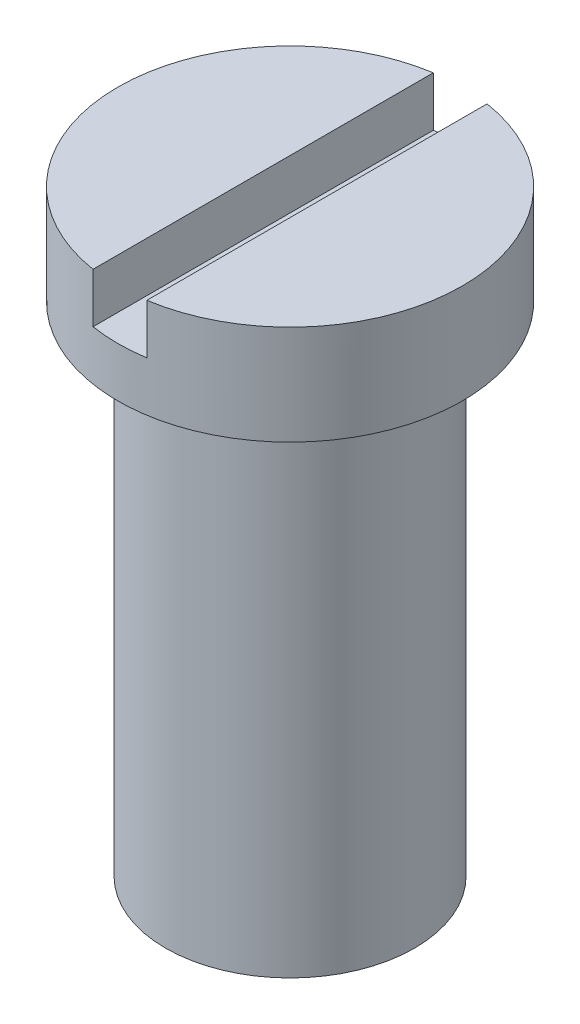
ISO-10303-21;
HEADER;
FILE_DESCRIPTION(('STEP AP214'),'2;1');
FILE_NAME('part.step','',(''),(''),'','','');
FILE_SCHEMA(('AUTOMOTIVE_DESIGN { 1 0 10303 214 1 1 1 1 }'));
ENDSEC;
DATA;
#1=APPLICATION_CONTEXT('core data for automotive mechanical design processes');
#2=APPLICATION_PROTOCOL_DEFINITION('international standard','automotive_design',2000,#1);
#3=PRODUCT_CONTEXT('',#1,'mechanical');
#4=PRODUCT('Part','Part','',(#3));
#5=PRODUCT_RELATED_PRODUCT_CATEGORY('part','',(#4));
#6=PRODUCT_DEFINITION_FORMATION('','',#4);
#7=PRODUCT_DEFINITION_CONTEXT('part definition',#1,'design');
#8=PRODUCT_DEFINITION('design','',#6,#7);
#9=PRODUCT_DEFINITION_SHAPE('','',#8);
#10=(LENGTH_UNIT() NAMED_UNIT(*) SI_UNIT(.MILLI.,.METRE.));
#11=(NAMED_UNIT(*) PLANE_ANGLE_UNIT() SI_UNIT($,.RADIAN.));
#12=(NAMED_UNIT(*) SI_UNIT($,.STERADIAN.) SOLID_ANGLE_UNIT());
#13=UNCERTAINTY_MEASURE_WITH_UNIT(LENGTH_MEASURE(1.E-05),#10,'distance_accuracy_value','');
#14=(GEOMETRIC_REPRESENTATION_CONTEXT(3) GLOBAL_UNCERTAINTY_ASSIGNED_CONTEXT((#13)) GLOBAL_UNIT_ASSIGNED_CONTEXT((#10,
#11,#12)) REPRESENTATION_CONTEXT('',''));
#15=CARTESIAN_POINT('',(0.,0.,0.));
#16=DIRECTION('',(0.,0.,1.));
#17=DIRECTION('',(1.,0.,0.));
#18=AXIS2_PLACEMENT_3D('',#15,#16,#17);
#19=CARTESIAN_POINT('',(0.,12.,0.));
#20=DIRECTION('',(0.,1.,0.));
#21=DIRECTION('',(0.,0.,1.));
#22=AXIS2_PLACEMENT_3D('',#19,#20,#21);
#23=PLANE('',#22);
#24=CARTESIAN_POINT('',(0.,12.,0.));
#25=DIRECTION('',(0.,-1.,0.));
#26=DIRECTION('',(0.,0.,-1.));
#27=AXIS2_PLACEMENT_3D('',#24,#25,#26);
#28=CIRCLE('',#27,3.46);
#29=CARTESIAN_POINT('',(-0.54,12.,3.41760149812701));
#30=VERTEX_POINT('',#29);
#31=CARTESIAN_POINT('',(-0.54,12.,-3.41760149812701));
#32=VERTEX_POINT('',#31);
#33=EDGE_CURVE('E39',#30,#32,#28,.T.);
#34=ORIENTED_EDGE('',*,*,#33,.F.);
#35=DIRECTION('',(0.,0.,-1.));
#36=VECTOR('',#35,1.);
#37=CARTESIAN_POINT('',(-0.54,12.,3.461));
#38=LINE('',#37,#36);
#39=EDGE_CURVE('E81',#30,#32,#38,.T.);
#40=ORIENTED_EDGE('',*,*,#39,.T.);
#41=EDGE_LOOP('',(#34,#40));
#42=FACE_BOUND('',#41,.T.);
#43=ADVANCED_FACE('F32',(#42),#23,.T.);
#44=CARTESIAN_POINT('',(0.54,12.,-3.41760149812701));
#45=VERTEX_POINT('',#44);
#46=CARTESIAN_POINT('',(0.54,12.,3.41760149812701));
#47=VERTEX_POINT('',#46);
#48=EDGE_CURVE('E11',#45,#47,#28,.T.);
#49=ORIENTED_EDGE('',*,*,#48,.F.);
#50=DIRECTION('',(0.,0.,-1.));
#51=VECTOR('',#50,1.);
#52=CARTESIAN_POINT('',(0.54,12.,3.461));
#53=LINE('',#52,#51);
#54=EDGE_CURVE('E71',#47,#45,#53,.T.);
#55=ORIENTED_EDGE('',*,*,#54,.F.);
#56=EDGE_LOOP('',(#49,#55));
#57=FACE_BOUND('',#56,.T.);
#58=ADVANCED_FACE('F90',(#57),#23,.T.);
#59=CARTESIAN_POINT('',(0.,0.,0.));
#60=DIRECTION('',(0.,-1.,0.));
#61=DIRECTION('',(0.,0.,-1.));
#62=AXIS2_PLACEMENT_3D('',#59,#60,#61);
#63=CYLINDRICAL_SURFACE('',#62,3.46);
#64=CARTESIAN_POINT('',(0.,10.,0.));
#65=DIRECTION('',(0.,-1.,0.));
#66=DIRECTION('',(0.,0.,-1.));
#67=AXIS2_PLACEMENT_3D('',#64,#65,#66);
#68=CIRCLE('',#67,3.46);
#69=CARTESIAN_POINT('',(0.,10.,-3.46));
#70=VERTEX_POINT('',#69);
#71=EDGE_CURVE('E104',#70,#70,#68,.T.);
#72=ORIENTED_EDGE('',*,*,#71,.F.);
#73=EDGE_LOOP('',(#72));
#74=FACE_BOUND('',#73,.T.);
#75=ORIENTED_EDGE('',*,*,#33,.T.);
#76=DIRECTION('',(0.,-1.,0.));
#77=VECTOR('',#76,1.);
#78=CARTESIAN_POINT('',(-0.54,0.,-3.41760149812701));
#79=LINE('',#78,#77);
#80=CARTESIAN_POINT('',(-0.54,11.,-3.41760149812701));
#81=VERTEX_POINT('',#80);
#82=EDGE_CURVE('E88',#32,#81,#79,.T.);
#83=ORIENTED_EDGE('',*,*,#82,.T.);
#84=CARTESIAN_POINT('',(0.,11.,0.));
#85=DIRECTION('',(0.,-1.,0.));
#86=DIRECTION('',(0.,0.,-1.));
#87=AXIS2_PLACEMENT_3D('',#84,#85,#86);
#88=CIRCLE('',#87,3.46);
#89=CARTESIAN_POINT('',(0.54,11.,-3.41760149812701));
#90=VERTEX_POINT('',#89);
#91=EDGE_CURVE('E87',#81,#90,#88,.T.);
#92=ORIENTED_EDGE('',*,*,#91,.T.);
#93=DIRECTION('',(0.,-1.,0.));
#94=VECTOR('',#93,1.);
#95=CARTESIAN_POINT('',(0.54,0.,-3.41760149812701));
#96=LINE('',#95,#94);
#97=EDGE_CURVE('E74',#90,#45,#96,.F.);
#98=ORIENTED_EDGE('',*,*,#97,.T.);
#99=ORIENTED_EDGE('',*,*,#48,.T.);
#100=DIRECTION('',(0.,-1.,0.));
#101=VECTOR('',#100,1.);
#102=CARTESIAN_POINT('',(0.54,0.,3.41760149812701));
#103=LINE('',#102,#101);
#104=CARTESIAN_POINT('',(0.54,11.,3.41760149812701));
#105=VERTEX_POINT('',#104);
#106=EDGE_CURVE('E77',#105,#47,#103,.F.);
#107=ORIENTED_EDGE('',*,*,#106,.F.);
#108=CARTESIAN_POINT('',(0.,11.,0.));
#109=DIRECTION('',(0.,1.,0.));
#110=DIRECTION('',(0.,0.,1.));
#111=AXIS2_PLACEMENT_3D('',#108,#109,#110);
#112=CIRCLE('',#111,3.46);
#113=CARTESIAN_POINT('',(-0.54,11.,3.41760149812701));
#114=VERTEX_POINT('',#113);
#115=EDGE_CURVE('E46',#114,#105,#112,.T.);
#116=ORIENTED_EDGE('',*,*,#115,.F.);
#117=DIRECTION('',(0.,-1.,0.));
#118=VECTOR('',#117,1.);
#119=CARTESIAN_POINT('',(-0.54,0.,3.41760149812701));
#120=LINE('',#119,#118);
#121=EDGE_CURVE('E118',#30,#114,#120,.T.);
#122=ORIENTED_EDGE('',*,*,#121,.F.);
#123=EDGE_LOOP('',(#75,#83,#92,#98,#99,#107,#116,#122));
#124=FACE_BOUND('',#123,.T.);
#125=ADVANCED_FACE('F85',(#74,#124),#63,.T.);
#126=CARTESIAN_POINT('',(3.46,10.,0.));
#127=DIRECTION('',(0.,-1.,0.));
#128=DIRECTION('',(0.,0.,-1.));
#129=AXIS2_PLACEMENT_3D('',#126,#127,#128);
#130=PLANE('',#129);
#131=ORIENTED_EDGE('',*,*,#71,.T.);
#132=EDGE_LOOP('',(#131));
#133=FACE_BOUND('',#132,.T.);
#134=CARTESIAN_POINT('',(0.,10.,0.));
#135=DIRECTION('',(0.,-1.,0.));
#136=DIRECTION('',(0.,0.,-1.));
#137=AXIS2_PLACEMENT_3D('',#134,#135,#136);
#138=CIRCLE('',#137,2.5);
#139=CARTESIAN_POINT('',(0.,10.,-2.5));
#140=VERTEX_POINT('',#139);
#141=EDGE_CURVE('E106',#140,#140,#138,.T.);
#142=ORIENTED_EDGE('',*,*,#141,.F.);
#143=EDGE_LOOP('',(#142));
#144=FACE_BOUND('',#143,.T.);
#145=ADVANCED_FACE('F96',(#133,#144),#130,.T.);
#146=CARTESIAN_POINT('',(0.,0.,0.));
#147=DIRECTION('',(0.,-1.,0.));
#148=DIRECTION('',(0.,0.,-1.));
#149=AXIS2_PLACEMENT_3D('',#146,#147,#148);
#150=CYLINDRICAL_SURFACE('',#149,2.5);
#151=ORIENTED_EDGE('',*,*,#141,.T.);
#152=EDGE_LOOP('',(#151));
#153=FACE_BOUND('',#152,.T.);
#154=CARTESIAN_POINT('',(0.,0.,0.));
#155=DIRECTION('',(0.,-1.,0.));
#156=DIRECTION('',(0.,0.,-1.));
#157=AXIS2_PLACEMENT_3D('',#154,#155,#156);
#158=CIRCLE('',#157,2.5);
#159=CARTESIAN_POINT('',(0.,0.,-2.5));
#160=VERTEX_POINT('',#159);
#161=EDGE_CURVE('E110',#160,#160,#158,.T.);
#162=ORIENTED_EDGE('',*,*,#161,.F.);
#163=EDGE_LOOP('',(#162));
#164=FACE_BOUND('',#163,.T.);
#165=ADVANCED_FACE('F138',(#153,#164),#150,.T.);
#166=CARTESIAN_POINT('',(2.5,0.,0.));
#167=DIRECTION('',(0.,-1.,0.));
#168=DIRECTION('',(0.,0.,-1.));
#169=AXIS2_PLACEMENT_3D('',#166,#167,#168);
#170=PLANE('',#169);
#171=ORIENTED_EDGE('',*,*,#161,.T.);
#172=EDGE_LOOP('',(#171));
#173=FACE_BOUND('',#172,.T.);
#174=ADVANCED_FACE('F133',(#173),#170,.T.);
#175=CARTESIAN_POINT('',(-0.54,12.,3.461));
#176=DIRECTION('',(1.,0.,0.));
#177=DIRECTION('',(0.,0.,-1.));
#178=AXIS2_PLACEMENT_3D('',#175,#176,#177);
#179=PLANE('',#178);
#180=ORIENTED_EDGE('',*,*,#121,.T.);
#181=DIRECTION('',(0.,0.,-1.));
#182=VECTOR('',#181,1.);
#183=CARTESIAN_POINT('',(-0.54,11.,3.461));
#184=LINE('',#183,#182);
#185=EDGE_CURVE('E51',#114,#81,#184,.T.);
#186=ORIENTED_EDGE('',*,*,#185,.T.);
#187=ORIENTED_EDGE('',*,*,#82,.F.);
#188=ORIENTED_EDGE('',*,*,#39,.F.);
#189=EDGE_LOOP('',(#180,#186,#187,#188));
#190=FACE_BOUND('',#189,.T.);
#191=ADVANCED_FACE('F124',(#190),#179,.T.);
#192=CARTESIAN_POINT('',(-0.54,11.,3.461));
#193=DIRECTION('',(0.,1.,0.));
#194=DIRECTION('',(0.,0.,1.));
#195=AXIS2_PLACEMENT_3D('',#192,#193,#194);
#196=PLANE('',#195);
#197=ORIENTED_EDGE('',*,*,#115,.T.);
#198=DIRECTION('',(0.,0.,-1.));
#199=VECTOR('',#198,1.);
#200=CARTESIAN_POINT('',(0.54,11.,3.461));
#201=LINE('',#200,#199);
#202=EDGE_CURVE('E80',#105,#90,#201,.T.);
#203=ORIENTED_EDGE('',*,*,#202,.T.);
#204=ORIENTED_EDGE('',*,*,#91,.F.);
#205=ORIENTED_EDGE('',*,*,#185,.F.);
#206=EDGE_LOOP('',(#197,#203,#204,#205));
#207=FACE_BOUND('',#206,.T.);
#208=ADVANCED_FACE('F125',(#207),#196,.T.);
#209=CARTESIAN_POINT('',(0.54,12.,3.461));
#210=DIRECTION('',(-1.,0.,0.));
#211=DIRECTION('',(0.,0.,1.));
#212=AXIS2_PLACEMENT_3D('',#209,#210,#211);
#213=PLANE('',#212);
#214=ORIENTED_EDGE('',*,*,#106,.T.);
#215=ORIENTED_EDGE('',*,*,#54,.T.);
#216=ORIENTED_EDGE('',*,*,#97,.F.);
#217=ORIENTED_EDGE('',*,*,#202,.F.);
#218=EDGE_LOOP('',(#214,#215,#216,#217));
#219=FACE_BOUND('',#218,.T.);
#220=ADVANCED_FACE('F73',(#219),#213,.T.);
#221=CLOSED_SHELL('',(#43,#58,#125,#145,#165,#174,#191,#208,#220));
#222=MANIFOLD_SOLID_BREP('B2',#221);
#223=ADVANCED_BREP_SHAPE_REPRESENTATION('',(#18,#222),#14);
#224=SHAPE_DEFINITION_REPRESENTATION(#9,#223);
ENDSEC;
END-ISO-10303-21;
